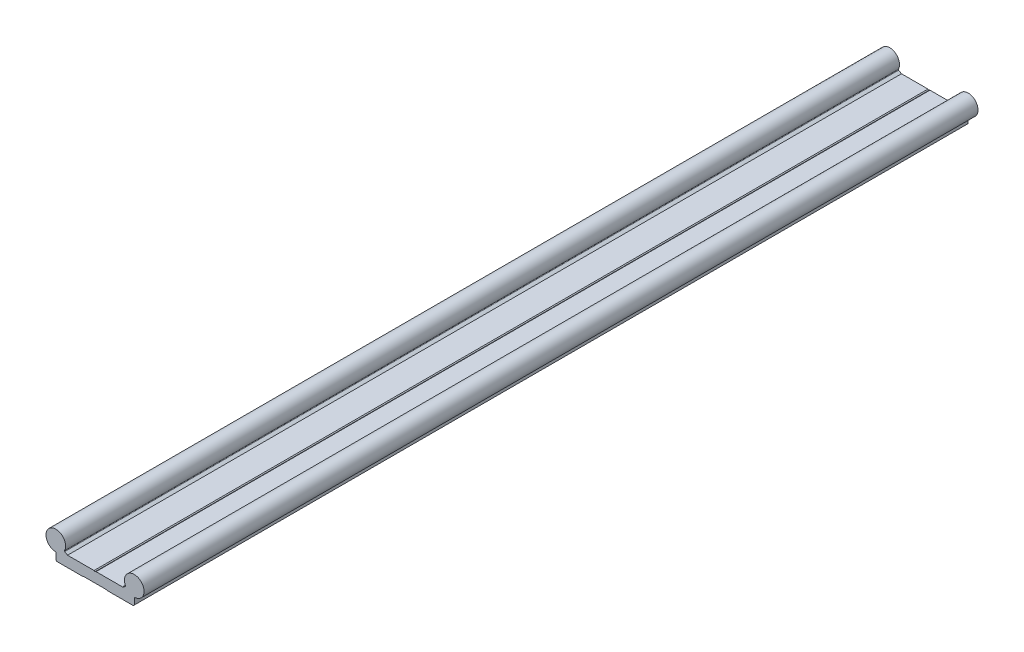
ISO-10303-21;
HEADER;
FILE_DESCRIPTION(('STEP AP214'),'2;1');
FILE_NAME('part.step','',(''),(''),'','','');
FILE_SCHEMA(('AUTOMOTIVE_DESIGN { 1 0 10303 214 1 1 1 1 }'));
ENDSEC;
DATA;
#1=APPLICATION_CONTEXT('core data for automotive mechanical design processes');
#2=APPLICATION_PROTOCOL_DEFINITION('international standard','automotive_design',2000,#1);
#3=PRODUCT_CONTEXT('',#1,'mechanical');
#4=PRODUCT('Part','Part','',(#3));
#5=PRODUCT_RELATED_PRODUCT_CATEGORY('part','',(#4));
#6=PRODUCT_DEFINITION_FORMATION('','',#4);
#7=PRODUCT_DEFINITION_CONTEXT('part definition',#1,'design');
#8=PRODUCT_DEFINITION('design','',#6,#7);
#9=PRODUCT_DEFINITION_SHAPE('','',#8);
#10=(LENGTH_UNIT() NAMED_UNIT(*) SI_UNIT(.MILLI.,.METRE.));
#11=(NAMED_UNIT(*) PLANE_ANGLE_UNIT() SI_UNIT($,.RADIAN.));
#12=(NAMED_UNIT(*) SI_UNIT($,.STERADIAN.) SOLID_ANGLE_UNIT());
#13=UNCERTAINTY_MEASURE_WITH_UNIT(LENGTH_MEASURE(1.E-05),#10,'distance_accuracy_value','');
#14=(GEOMETRIC_REPRESENTATION_CONTEXT(3) GLOBAL_UNCERTAINTY_ASSIGNED_CONTEXT((#13)) GLOBAL_UNIT_ASSIGNED_CONTEXT((#10,
#11,#12)) REPRESENTATION_CONTEXT('',''));
#15=CARTESIAN_POINT('',(0.,0.,0.));
#16=DIRECTION('',(0.,0.,1.));
#17=DIRECTION('',(1.,0.,0.));
#18=AXIS2_PLACEMENT_3D('',#15,#16,#17);
#19=CARTESIAN_POINT('',(-20.,3.708497,0.));
#20=DIRECTION('',(-1.,0.,0.));
#21=DIRECTION('',(0.,0.,1.));
#22=AXIS2_PLACEMENT_3D('',#19,#20,#21);
#23=PLANE('',#22);
#24=DIRECTION('',(0.,-1.,0.));
#25=VECTOR('',#24,1.);
#26=CARTESIAN_POINT('',(-20.,3.708497,425.));
#27=LINE('',#26,#25);
#28=CARTESIAN_POINT('',(-20.,3.708497,425.));
#29=VERTEX_POINT('',#28);
#30=CARTESIAN_POINT('',(-20.,0.500000000000001,425.));
#31=VERTEX_POINT('',#30);
#32=EDGE_CURVE('E207',#29,#31,#27,.T.);
#33=ORIENTED_EDGE('',*,*,#32,.F.);
#34=DIRECTION('',(0.,0.,1.));
#35=VECTOR('',#34,1.);
#36=CARTESIAN_POINT('',(-20.,3.708497,0.));
#37=LINE('',#36,#35);
#38=CARTESIAN_POINT('',(-20.,3.708497,0.));
#39=VERTEX_POINT('',#38);
#40=EDGE_CURVE('E11',#39,#29,#37,.T.);
#41=ORIENTED_EDGE('',*,*,#40,.F.);
#42=DIRECTION('',(0.,-1.,0.));
#43=VECTOR('',#42,1.);
#44=CARTESIAN_POINT('',(-20.,3.708497,0.));
#45=LINE('',#44,#43);
#46=CARTESIAN_POINT('',(-20.,0.500000000000001,0.));
#47=VERTEX_POINT('',#46);
#48=EDGE_CURVE('E266',#39,#47,#45,.T.);
#49=ORIENTED_EDGE('',*,*,#48,.T.);
#50=DIRECTION('',(0.,0.,1.));
#51=VECTOR('',#50,1.);
#52=CARTESIAN_POINT('',(-20.,0.500000000000001,0.));
#53=LINE('',#52,#51);
#54=EDGE_CURVE('E35',#47,#31,#53,.T.);
#55=ORIENTED_EDGE('',*,*,#54,.T.);
#56=EDGE_LOOP('',(#33,#41,#49,#55));
#57=FACE_BOUND('',#56,.T.);
#58=ADVANCED_FACE('F32',(#57),#23,.T.);
#59=CARTESIAN_POINT('',(-20.3,3.708497,0.));
#60=DIRECTION('',(0.,0.,1.));
#61=DIRECTION('',(1.,0.,0.));
#62=AXIS2_PLACEMENT_3D('',#59,#60,#61);
#63=CYLINDRICAL_SURFACE('',#62,0.299999999999948);
#64=CARTESIAN_POINT('',(-20.3,3.708497,425.));
#65=DIRECTION('',(0.,0.,-1.));
#66=DIRECTION('',(-1.,0.,0.));
#67=AXIS2_PLACEMENT_3D('',#64,#65,#66);
#68=CIRCLE('',#67,0.299999999999948);
#69=CARTESIAN_POINT('',(-20.2830188679496,4.00801601634825,425.));
#70=VERTEX_POINT('',#69);
#71=EDGE_CURVE('E264',#70,#29,#68,.T.);
#72=ORIENTED_EDGE('',*,*,#71,.F.);
#73=DIRECTION('',(0.,0.,1.));
#74=VECTOR('',#73,1.);
#75=CARTESIAN_POINT('',(-20.2830188679496,4.00801601634825,0.));
#76=LINE('',#75,#74);
#77=CARTESIAN_POINT('',(-20.2830188679496,4.00801601634825,0.));
#78=VERTEX_POINT('',#77);
#79=EDGE_CURVE('E41',#78,#70,#76,.T.);
#80=ORIENTED_EDGE('',*,*,#79,.F.);
#81=CARTESIAN_POINT('',(-20.3,3.708497,0.));
#82=DIRECTION('',(0.,0.,-1.));
#83=DIRECTION('',(-1.,0.,0.));
#84=AXIS2_PLACEMENT_3D('',#81,#82,#83);
#85=CIRCLE('',#84,0.299999999999948);
#86=EDGE_CURVE('E197',#78,#39,#85,.T.);
#87=ORIENTED_EDGE('',*,*,#86,.T.);
#88=ORIENTED_EDGE('',*,*,#40,.T.);
#89=EDGE_LOOP('',(#72,#80,#87,#88));
#90=FACE_BOUND('',#89,.T.);
#91=ADVANCED_FACE('F304',(#90),#63,.F.);
#92=CARTESIAN_POINT('',(-19.9999999910255,8.99999978829809,0.));
#93=DIRECTION('',(0.,0.,1.));
#94=DIRECTION('',(1.,0.,0.));
#95=AXIS2_PLACEMENT_3D('',#92,#93,#94);
#96=CYLINDRICAL_SURFACE('',#95,5.00000016641058);
#97=CARTESIAN_POINT('',(-19.9999999910255,8.99999978829809,425.));
#98=DIRECTION('',(0.,0.,1.));
#99=DIRECTION('',(1.,0.,0.));
#100=AXIS2_PLACEMENT_3D('',#97,#98,#99);
#101=CIRCLE('',#100,5.00000016641058);
#102=CARTESIAN_POINT('',(-15.5486051742578,6.72292143010332,425.));
#103=VERTEX_POINT('',#102);
#104=EDGE_CURVE('E184',#103,#70,#101,.T.);
#105=ORIENTED_EDGE('',*,*,#104,.F.);
#106=DIRECTION('',(0.,0.,1.));
#107=VECTOR('',#106,1.);
#108=CARTESIAN_POINT('',(-15.5486051742578,6.72292143010332,0.));
#109=LINE('',#108,#107);
#110=CARTESIAN_POINT('',(-15.5486051742578,6.72292143010332,0.));
#111=VERTEX_POINT('',#110);
#112=EDGE_CURVE('E179',#111,#103,#109,.T.);
#113=ORIENTED_EDGE('',*,*,#112,.F.);
#114=CARTESIAN_POINT('',(-19.9999999910255,8.99999978829809,0.));
#115=DIRECTION('',(0.,0.,1.));
#116=DIRECTION('',(1.,0.,0.));
#117=AXIS2_PLACEMENT_3D('',#114,#115,#116);
#118=CIRCLE('',#117,5.00000016641058);
#119=EDGE_CURVE('E182',#111,#78,#118,.T.);
#120=ORIENTED_EDGE('',*,*,#119,.T.);
#121=ORIENTED_EDGE('',*,*,#79,.T.);
#122=EDGE_LOOP('',(#105,#113,#120,#121));
#123=FACE_BOUND('',#122,.T.);
#124=ADVANCED_FACE('F181',(#123),#96,.T.);
#125=CARTESIAN_POINT('',(-15.2815211177297,6.58629654060844,0.));
#126=DIRECTION('',(0.,0.,1.));
#127=DIRECTION('',(1.,0.,0.));
#128=AXIS2_PLACEMENT_3D('',#125,#126,#127);
#129=CYLINDRICAL_SURFACE('',#128,0.300000422801319);
#130=CARTESIAN_POINT('',(-15.2815211177297,6.58629654060844,425.));
#131=DIRECTION('',(0.,0.,-1.));
#132=DIRECTION('',(-1.,0.,0.));
#133=AXIS2_PLACEMENT_3D('',#130,#131,#132);
#134=CIRCLE('',#133,0.300000422801319);
#135=CARTESIAN_POINT('',(-15.431521324407,6.32648855058939,425.));
#136=VERTEX_POINT('',#135);
#137=EDGE_CURVE('E261',#136,#103,#134,.T.);
#138=ORIENTED_EDGE('',*,*,#137,.F.);
#139=DIRECTION('',(0.,0.,1.));
#140=VECTOR('',#139,1.);
#141=CARTESIAN_POINT('',(-15.431521324407,6.32648855058939,0.));
#142=LINE('',#141,#140);
#143=CARTESIAN_POINT('',(-15.431521324407,6.32648855058939,0.));
#144=VERTEX_POINT('',#143);
#145=EDGE_CURVE('E189',#144,#136,#142,.T.);
#146=ORIENTED_EDGE('',*,*,#145,.F.);
#147=CARTESIAN_POINT('',(-15.2815211177297,6.58629654060844,0.));
#148=DIRECTION('',(0.,0.,-1.));
#149=DIRECTION('',(-1.,0.,0.));
#150=AXIS2_PLACEMENT_3D('',#147,#148,#149);
#151=CIRCLE('',#150,0.300000422801319);
#152=EDGE_CURVE('E195',#144,#111,#151,.T.);
#153=ORIENTED_EDGE('',*,*,#152,.T.);
#154=ORIENTED_EDGE('',*,*,#112,.T.);
#155=EDGE_LOOP('',(#138,#146,#153,#154));
#156=FACE_BOUND('',#155,.T.);
#157=ADVANCED_FACE('F199',(#156),#129,.F.);
#158=CARTESIAN_POINT('',(-14.000000170596,5.49999946178658,0.));
#159=DIRECTION('',(0.499999984255417,0.866025412874578,0.));
#160=DIRECTION('',(-0.866025412874578,0.499999984255417,0.));
#161=AXIS2_PLACEMENT_3D('',#158,#159,#160);
#162=PLANE('',#161);
#163=DIRECTION('',(-0.866025412874578,0.499999984255417,0.));
#164=VECTOR('',#163,1.);
#165=CARTESIAN_POINT('',(-14.000000170596,5.49999946178658,425.));
#166=LINE('',#165,#164);
#167=CARTESIAN_POINT('',(-14.000000170596,5.49999946178658,425.));
#168=VERTEX_POINT('',#167);
#169=EDGE_CURVE('E258',#168,#136,#166,.T.);
#170=ORIENTED_EDGE('',*,*,#169,.F.);
#171=DIRECTION('',(0.,0.,1.));
#172=VECTOR('',#171,1.);
#173=CARTESIAN_POINT('',(-14.000000170596,5.49999946178658,0.));
#174=LINE('',#173,#172);
#175=CARTESIAN_POINT('',(-14.000000170596,5.49999946178658,0.));
#176=VERTEX_POINT('',#175);
#177=EDGE_CURVE('E270',#176,#168,#174,.T.);
#178=ORIENTED_EDGE('',*,*,#177,.F.);
#179=DIRECTION('',(-0.866025412874578,0.499999984255417,0.));
#180=VECTOR('',#179,1.);
#181=CARTESIAN_POINT('',(-14.000000170596,5.49999946178658,0.));
#182=LINE('',#181,#180);
#183=EDGE_CURVE('E200',#176,#144,#182,.T.);
#184=ORIENTED_EDGE('',*,*,#183,.T.);
#185=ORIENTED_EDGE('',*,*,#145,.T.);
#186=EDGE_LOOP('',(#170,#178,#184,#185));
#187=FACE_BOUND('',#186,.T.);
#188=ADVANCED_FACE('F317',(#187),#162,.T.);
#189=CARTESIAN_POINT('',(-0.500000170595967,5.49999946178658,0.));
#190=DIRECTION('',(0.,1.,0.));
#191=DIRECTION('',(0.,0.,1.));
#192=AXIS2_PLACEMENT_3D('',#189,#190,#191);
#193=PLANE('',#192);
#194=DIRECTION('',(-1.,0.,0.));
#195=VECTOR('',#194,1.);
#196=CARTESIAN_POINT('',(-0.500000170595967,5.49999946178658,425.));
#197=LINE('',#196,#195);
#198=CARTESIAN_POINT('',(-0.500000170595967,5.49999946178658,425.));
#199=VERTEX_POINT('',#198);
#200=EDGE_CURVE('E255',#199,#168,#197,.T.);
#201=ORIENTED_EDGE('',*,*,#200,.F.);
#202=DIRECTION('',(0.,0.,1.));
#203=VECTOR('',#202,1.);
#204=CARTESIAN_POINT('',(-0.500000170595967,5.49999946178658,0.));
#205=LINE('',#204,#203);
#206=CARTESIAN_POINT('',(-0.500000170595967,5.49999946178658,0.));
#207=VERTEX_POINT('',#206);
#208=EDGE_CURVE('E272',#207,#199,#205,.T.);
#209=ORIENTED_EDGE('',*,*,#208,.F.);
#210=DIRECTION('',(-1.,0.,0.));
#211=VECTOR('',#210,1.);
#212=CARTESIAN_POINT('',(-0.500000170595967,5.49999946178658,0.));
#213=LINE('',#212,#211);
#214=EDGE_CURVE('E202',#207,#176,#213,.T.);
#215=ORIENTED_EDGE('',*,*,#214,.T.);
#216=ORIENTED_EDGE('',*,*,#177,.T.);
#217=EDGE_LOOP('',(#201,#209,#215,#216));
#218=FACE_BOUND('',#217,.T.);
#219=ADVANCED_FACE('F320',(#218),#193,.T.);
#220=CARTESIAN_POINT('',(-1.70595966294401E-07,5.21132446178658,0.));
#221=DIRECTION('',(0.499999825156179,0.866025504730543,0.));
#222=DIRECTION('',(-0.866025504730543,0.499999825156179,0.));
#223=AXIS2_PLACEMENT_3D('',#220,#221,#222);
#224=PLANE('',#223);
#225=DIRECTION('',(-0.866025504730542,0.499999825156179,0.));
#226=VECTOR('',#225,1.);
#227=CARTESIAN_POINT('',(-1.70595966294401E-07,5.21132446178658,425.));
#228=LINE('',#227,#226);
#229=CARTESIAN_POINT('',(-1.70595966294401E-07,5.21132446178658,425.));
#230=VERTEX_POINT('',#229);
#231=EDGE_CURVE('E252',#230,#199,#228,.T.);
#232=ORIENTED_EDGE('',*,*,#231,.F.);
#233=DIRECTION('',(0.,0.,1.));
#234=VECTOR('',#233,1.);
#235=CARTESIAN_POINT('',(-1.70595966294401E-07,5.21132446178658,0.));
#236=LINE('',#235,#234);
#237=CARTESIAN_POINT('',(-1.70595966294401E-07,5.21132446178658,0.));
#238=VERTEX_POINT('',#237);
#239=EDGE_CURVE('E274',#238,#230,#236,.T.);
#240=ORIENTED_EDGE('',*,*,#239,.F.);
#241=DIRECTION('',(-0.866025504730542,0.499999825156179,0.));
#242=VECTOR('',#241,1.);
#243=CARTESIAN_POINT('',(-1.70595966294401E-07,5.21132446178658,0.));
#244=LINE('',#243,#242);
#245=EDGE_CURVE('E569',#238,#207,#244,.T.);
#246=ORIENTED_EDGE('',*,*,#245,.T.);
#247=ORIENTED_EDGE('',*,*,#208,.T.);
#248=EDGE_LOOP('',(#232,#240,#246,#247));
#249=FACE_BOUND('',#248,.T.);
#250=ADVANCED_FACE('F324',(#249),#224,.T.);
#251=CARTESIAN_POINT('',(0.499999829404034,5.49999946178658,0.));
#252=DIRECTION('',(-0.499999825156179,0.866025504730542,0.));
#253=DIRECTION('',(-0.866025504730543,-0.499999825156179,0.));
#254=AXIS2_PLACEMENT_3D('',#251,#252,#253);
#255=PLANE('',#254);
#256=DIRECTION('',(-0.866025504730542,-0.499999825156179,0.));
#257=VECTOR('',#256,1.);
#258=CARTESIAN_POINT('',(0.499999829404034,5.49999946178658,425.));
#259=LINE('',#258,#257);
#260=CARTESIAN_POINT('',(0.499999829404034,5.49999946178658,425.));
#261=VERTEX_POINT('',#260);
#262=EDGE_CURVE('E249',#261,#230,#259,.T.);
#263=ORIENTED_EDGE('',*,*,#262,.F.);
#264=DIRECTION('',(0.,0.,1.));
#265=VECTOR('',#264,1.);
#266=CARTESIAN_POINT('',(0.499999829404034,5.49999946178658,0.));
#267=LINE('',#266,#265);
#268=CARTESIAN_POINT('',(0.499999829404034,5.49999946178658,0.));
#269=VERTEX_POINT('',#268);
#270=EDGE_CURVE('E276',#269,#261,#267,.T.);
#271=ORIENTED_EDGE('',*,*,#270,.F.);
#272=DIRECTION('',(-0.866025504730542,-0.499999825156179,0.));
#273=VECTOR('',#272,1.);
#274=CARTESIAN_POINT('',(0.499999829404034,5.49999946178658,0.));
#275=LINE('',#274,#273);
#276=EDGE_CURVE('E573',#269,#238,#275,.T.);
#277=ORIENTED_EDGE('',*,*,#276,.T.);
#278=ORIENTED_EDGE('',*,*,#239,.T.);
#279=EDGE_LOOP('',(#263,#271,#277,#278));
#280=FACE_BOUND('',#279,.T.);
#281=ADVANCED_FACE('F328',(#280),#255,.T.);
#282=CARTESIAN_POINT('',(13.999999829404,5.49999946178658,0.));
#283=DIRECTION('',(0.,1.,0.));
#284=DIRECTION('',(0.,0.,1.));
#285=AXIS2_PLACEMENT_3D('',#282,#283,#284);
#286=PLANE('',#285);
#287=DIRECTION('',(-1.,0.,0.));
#288=VECTOR('',#287,1.);
#289=CARTESIAN_POINT('',(13.999999829404,5.49999946178658,425.));
#290=LINE('',#289,#288);
#291=CARTESIAN_POINT('',(13.999999829404,5.49999946178658,425.));
#292=VERTEX_POINT('',#291);
#293=EDGE_CURVE('E246',#292,#261,#290,.T.);
#294=ORIENTED_EDGE('',*,*,#293,.F.);
#295=DIRECTION('',(0.,0.,1.));
#296=VECTOR('',#295,1.);
#297=CARTESIAN_POINT('',(13.999999829404,5.49999946178658,0.));
#298=LINE('',#297,#296);
#299=CARTESIAN_POINT('',(13.999999829404,5.49999946178658,0.));
#300=VERTEX_POINT('',#299);
#301=EDGE_CURVE('E278',#300,#292,#298,.T.);
#302=ORIENTED_EDGE('',*,*,#301,.F.);
#303=DIRECTION('',(-1.,0.,0.));
#304=VECTOR('',#303,1.);
#305=CARTESIAN_POINT('',(13.999999829404,5.49999946178658,0.));
#306=LINE('',#305,#304);
#307=EDGE_CURVE('E562',#300,#269,#306,.T.);
#308=ORIENTED_EDGE('',*,*,#307,.T.);
#309=ORIENTED_EDGE('',*,*,#270,.T.);
#310=EDGE_LOOP('',(#294,#302,#308,#309));
#311=FACE_BOUND('',#310,.T.);
#312=ADVANCED_FACE('F332',(#311),#286,.T.);
#313=CARTESIAN_POINT('',(15.4315209832149,6.32648855058936,0.));
#314=DIRECTION('',(-0.499999984255416,0.866025412874578,0.));
#315=DIRECTION('',(-0.866025412874578,-0.499999984255416,0.));
#316=AXIS2_PLACEMENT_3D('',#313,#314,#315);
#317=PLANE('',#316);
#318=DIRECTION('',(-0.866025412874578,-0.499999984255416,0.));
#319=VECTOR('',#318,1.);
#320=CARTESIAN_POINT('',(15.4315209832149,6.32648855058936,425.));
#321=LINE('',#320,#319);
#322=CARTESIAN_POINT('',(15.4315209832149,6.32648855058936,425.));
#323=VERTEX_POINT('',#322);
#324=EDGE_CURVE('E243',#323,#292,#321,.T.);
#325=ORIENTED_EDGE('',*,*,#324,.F.);
#326=DIRECTION('',(0.,0.,1.));
#327=VECTOR('',#326,1.);
#328=CARTESIAN_POINT('',(15.4315209832149,6.32648855058936,0.));
#329=LINE('',#328,#327);
#330=CARTESIAN_POINT('',(15.4315209832149,6.32648855058936,0.));
#331=VERTEX_POINT('',#330);
#332=EDGE_CURVE('E280',#331,#323,#329,.T.);
#333=ORIENTED_EDGE('',*,*,#332,.F.);
#334=DIRECTION('',(-0.866025412874578,-0.499999984255416,0.));
#335=VECTOR('',#334,1.);
#336=CARTESIAN_POINT('',(15.4315209832149,6.32648855058936,0.));
#337=LINE('',#336,#335);
#338=EDGE_CURVE('E558',#331,#300,#337,.T.);
#339=ORIENTED_EDGE('',*,*,#338,.T.);
#340=ORIENTED_EDGE('',*,*,#301,.T.);
#341=EDGE_LOOP('',(#325,#333,#339,#340));
#342=FACE_BOUND('',#341,.T.);
#343=ADVANCED_FACE('F336',(#342),#317,.T.);
#344=CARTESIAN_POINT('',(15.2815208238851,6.58629645860024,0.));
#345=DIRECTION('',(0.,0.,1.));
#346=DIRECTION('',(1.,0.,0.));
#347=AXIS2_PLACEMENT_3D('',#344,#345,#346);
#348=CYLINDRICAL_SURFACE('',#347,0.300000328106433);
#349=CARTESIAN_POINT('',(15.2815208238851,6.58629645860024,425.));
#350=DIRECTION('',(0.,0.,-1.));
#351=DIRECTION('',(-1.,0.,0.));
#352=AXIS2_PLACEMENT_3D('',#349,#350,#351);
#353=CIRCLE('',#352,0.300000328106433);
#354=CARTESIAN_POINT('',(15.5486047963378,6.72292130452095,425.));
#355=VERTEX_POINT('',#354);
#356=EDGE_CURVE('E240',#355,#323,#353,.T.);
#357=ORIENTED_EDGE('',*,*,#356,.F.);
#358=DIRECTION('',(0.,0.,1.));
#359=VECTOR('',#358,1.);
#360=CARTESIAN_POINT('',(15.5486047963378,6.72292130452095,0.));
#361=LINE('',#360,#359);
#362=CARTESIAN_POINT('',(15.5486047963378,6.72292130452095,0.));
#363=VERTEX_POINT('',#362);
#364=EDGE_CURVE('E282',#363,#355,#361,.T.);
#365=ORIENTED_EDGE('',*,*,#364,.F.);
#366=CARTESIAN_POINT('',(15.2815208238851,6.58629645860024,0.));
#367=DIRECTION('',(0.,0.,-1.));
#368=DIRECTION('',(-1.,0.,0.));
#369=AXIS2_PLACEMENT_3D('',#366,#367,#368);
#370=CIRCLE('',#369,0.300000328106433);
#371=EDGE_CURVE('E579',#363,#331,#370,.T.);
#372=ORIENTED_EDGE('',*,*,#371,.T.);
#373=ORIENTED_EDGE('',*,*,#332,.T.);
#374=EDGE_LOOP('',(#357,#365,#372,#373));
#375=FACE_BOUND('',#374,.T.);
#376=ADVANCED_FACE('F340',(#375),#348,.F.);
#377=CARTESIAN_POINT('',(19.9999998258351,8.99999976210216,0.));
#378=DIRECTION('',(0.,0.,1.));
#379=DIRECTION('',(1.,0.,0.));
#380=AXIS2_PLACEMENT_3D('',#377,#378,#379);
#381=CYLINDRICAL_SURFACE('',#380,5.00000040106134);
#382=CARTESIAN_POINT('',(19.9999998258351,8.99999976210216,425.));
#383=DIRECTION('',(0.,0.,1.));
#384=DIRECTION('',(1.,0.,0.));
#385=AXIS2_PLACEMENT_3D('',#382,#383,#384);
#386=CIRCLE('',#385,5.00000040106134);
#387=CARTESIAN_POINT('',(20.283018838172,4.00801576280197,425.));
#388=VERTEX_POINT('',#387);
#389=EDGE_CURVE('E237',#388,#355,#386,.T.);
#390=ORIENTED_EDGE('',*,*,#389,.F.);
#391=DIRECTION('',(0.,0.,1.));
#392=VECTOR('',#391,1.);
#393=CARTESIAN_POINT('',(20.283018838172,4.00801576280197,0.));
#394=LINE('',#393,#392);
#395=CARTESIAN_POINT('',(20.283018838172,4.00801576280197,0.));
#396=VERTEX_POINT('',#395);
#397=EDGE_CURVE('E284',#396,#388,#394,.T.);
#398=ORIENTED_EDGE('',*,*,#397,.F.);
#399=CARTESIAN_POINT('',(19.9999998258351,8.99999976210216,0.));
#400=DIRECTION('',(0.,0.,1.));
#401=DIRECTION('',(1.,0.,0.));
#402=AXIS2_PLACEMENT_3D('',#399,#400,#401);
#403=CIRCLE('',#402,5.00000040106134);
#404=EDGE_CURVE('E551',#396,#363,#403,.T.);
#405=ORIENTED_EDGE('',*,*,#404,.T.);
#406=ORIENTED_EDGE('',*,*,#364,.T.);
#407=EDGE_LOOP('',(#390,#398,#405,#406));
#408=FACE_BOUND('',#407,.T.);
#409=ADVANCED_FACE('F344',(#408),#381,.T.);
#410=CARTESIAN_POINT('',(20.2999999762032,3.70849677062774,0.));
#411=DIRECTION('',(0.,0.,1.));
#412=DIRECTION('',(1.,0.,0.));
#413=AXIS2_PLACEMENT_3D('',#410,#411,#412);
#414=CYLINDRICAL_SURFACE('',#413,0.299999976203164);
#415=CARTESIAN_POINT('',(20.2999999762032,3.70849677062774,425.));
#416=DIRECTION('',(0.,0.,-1.));
#417=DIRECTION('',(-1.,0.,0.));
#418=AXIS2_PLACEMENT_3D('',#415,#416,#417);
#419=CIRCLE('',#418,0.299999976203164);
#420=CARTESIAN_POINT('',(20.,3.70849677062774,425.));
#421=VERTEX_POINT('',#420);
#422=EDGE_CURVE('E234',#421,#388,#419,.T.);
#423=ORIENTED_EDGE('',*,*,#422,.F.);
#424=DIRECTION('',(0.,0.,1.));
#425=VECTOR('',#424,1.);
#426=CARTESIAN_POINT('',(20.,3.70849677062774,0.));
#427=LINE('',#426,#425);
#428=CARTESIAN_POINT('',(20.,3.70849677062774,0.));
#429=VERTEX_POINT('',#428);
#430=EDGE_CURVE('E286',#429,#421,#427,.T.);
#431=ORIENTED_EDGE('',*,*,#430,.F.);
#432=CARTESIAN_POINT('',(20.2999999762032,3.70849677062774,0.));
#433=DIRECTION('',(0.,0.,-1.));
#434=DIRECTION('',(-1.,0.,0.));
#435=AXIS2_PLACEMENT_3D('',#432,#433,#434);
#436=CIRCLE('',#435,0.299999976203164);
#437=EDGE_CURVE('E547',#429,#396,#436,.T.);
#438=ORIENTED_EDGE('',*,*,#437,.T.);
#439=ORIENTED_EDGE('',*,*,#397,.T.);
#440=EDGE_LOOP('',(#423,#431,#438,#439));
#441=FACE_BOUND('',#440,.T.);
#442=ADVANCED_FACE('F348',(#441),#414,.F.);
#443=CARTESIAN_POINT('',(20.,0.5,0.));
#444=DIRECTION('',(1.,0.,0.));
#445=DIRECTION('',(0.,1.,0.));
#446=AXIS2_PLACEMENT_3D('',#443,#444,#445);
#447=PLANE('',#446);
#448=DIRECTION('',(0.,1.,0.));
#449=VECTOR('',#448,1.);
#450=CARTESIAN_POINT('',(20.,0.5,425.));
#451=LINE('',#450,#449);
#452=CARTESIAN_POINT('',(20.,0.5,425.));
#453=VERTEX_POINT('',#452);
#454=EDGE_CURVE('E231',#453,#421,#451,.T.);
#455=ORIENTED_EDGE('',*,*,#454,.F.);
#456=DIRECTION('',(0.,0.,1.));
#457=VECTOR('',#456,1.);
#458=CARTESIAN_POINT('',(20.,0.5,0.));
#459=LINE('',#458,#457);
#460=CARTESIAN_POINT('',(20.,0.5,0.));
#461=VERTEX_POINT('',#460);
#462=EDGE_CURVE('E288',#461,#453,#459,.T.);
#463=ORIENTED_EDGE('',*,*,#462,.F.);
#464=DIRECTION('',(0.,1.,0.));
#465=VECTOR('',#464,1.);
#466=CARTESIAN_POINT('',(20.,0.5,0.));
#467=LINE('',#466,#465);
#468=EDGE_CURVE('E583',#461,#429,#467,.T.);
#469=ORIENTED_EDGE('',*,*,#468,.T.);
#470=ORIENTED_EDGE('',*,*,#430,.T.);
#471=EDGE_LOOP('',(#455,#463,#469,#470));
#472=FACE_BOUND('',#471,.T.);
#473=ADVANCED_FACE('F352',(#472),#447,.T.);
#474=CARTESIAN_POINT('',(19.5,0.,0.));
#475=DIRECTION('',(0.707106781186547,-0.707106781186548,0.));
#476=DIRECTION('',(0.707106781186548,0.707106781186547,0.));
#477=AXIS2_PLACEMENT_3D('',#474,#475,#476);
#478=PLANE('',#477);
#479=DIRECTION('',(0.707106781186548,0.707106781186547,0.));
#480=VECTOR('',#479,1.);
#481=CARTESIAN_POINT('',(19.5,0.,425.));
#482=LINE('',#481,#480);
#483=CARTESIAN_POINT('',(19.5,0.,425.));
#484=VERTEX_POINT('',#483);
#485=EDGE_CURVE('E228',#484,#453,#482,.T.);
#486=ORIENTED_EDGE('',*,*,#485,.F.);
#487=DIRECTION('',(0.,0.,1.));
#488=VECTOR('',#487,1.);
#489=CARTESIAN_POINT('',(19.5,0.,0.));
#490=LINE('',#489,#488);
#491=CARTESIAN_POINT('',(19.5,0.,0.));
#492=VERTEX_POINT('',#491);
#493=EDGE_CURVE('E290',#492,#484,#490,.T.);
#494=ORIENTED_EDGE('',*,*,#493,.F.);
#495=DIRECTION('',(0.707106781186548,0.707106781186547,0.));
#496=VECTOR('',#495,1.);
#497=CARTESIAN_POINT('',(19.5,0.,0.));
#498=LINE('',#497,#496);
#499=EDGE_CURVE('E540',#492,#461,#498,.T.);
#500=ORIENTED_EDGE('',*,*,#499,.T.);
#501=ORIENTED_EDGE('',*,*,#462,.T.);
#502=EDGE_LOOP('',(#486,#494,#500,#501));
#503=FACE_BOUND('',#502,.T.);
#504=ADVANCED_FACE('F356',(#503),#478,.T.);
#505=CARTESIAN_POINT('',(6.,0.,0.));
#506=DIRECTION('',(0.,-1.,0.));
#507=DIRECTION('',(1.,0.,0.));
#508=AXIS2_PLACEMENT_3D('',#505,#506,#507);
#509=PLANE('',#508);
#510=DIRECTION('',(1.,0.,0.));
#511=VECTOR('',#510,1.);
#512=CARTESIAN_POINT('',(6.,0.,425.));
#513=LINE('',#512,#511);
#514=CARTESIAN_POINT('',(6.,0.,425.));
#515=VERTEX_POINT('',#514);
#516=EDGE_CURVE('E225',#515,#484,#513,.T.);
#517=ORIENTED_EDGE('',*,*,#516,.F.);
#518=DIRECTION('',(0.,0.,1.));
#519=VECTOR('',#518,1.);
#520=CARTESIAN_POINT('',(6.,0.,0.));
#521=LINE('',#520,#519);
#522=CARTESIAN_POINT('',(6.,0.,0.));
#523=VERTEX_POINT('',#522);
#524=EDGE_CURVE('E292',#523,#515,#521,.T.);
#525=ORIENTED_EDGE('',*,*,#524,.F.);
#526=DIRECTION('',(1.,0.,0.));
#527=VECTOR('',#526,1.);
#528=CARTESIAN_POINT('',(6.,0.,0.));
#529=LINE('',#528,#527);
#530=EDGE_CURVE('E536',#523,#492,#529,.T.);
#531=ORIENTED_EDGE('',*,*,#530,.T.);
#532=ORIENTED_EDGE('',*,*,#493,.T.);
#533=EDGE_LOOP('',(#517,#525,#531,#532));
#534=FACE_BOUND('',#533,.T.);
#535=ADVANCED_FACE('F360',(#534),#509,.T.);
#536=CARTESIAN_POINT('',(5.8,0.2,0.));
#537=DIRECTION('',(-0.707106781186547,-0.707106781186549,0.));
#538=DIRECTION('',(0.707106781186549,-0.707106781186546,0.));
#539=AXIS2_PLACEMENT_3D('',#536,#537,#538);
#540=PLANE('',#539);
#541=DIRECTION('',(0.707106781186549,-0.707106781186546,0.));
#542=VECTOR('',#541,1.);
#543=CARTESIAN_POINT('',(5.8,0.2,425.));
#544=LINE('',#543,#542);
#545=CARTESIAN_POINT('',(5.8,0.2,425.));
#546=VERTEX_POINT('',#545);
#547=EDGE_CURVE('E222',#546,#515,#544,.T.);
#548=ORIENTED_EDGE('',*,*,#547,.F.);
#549=DIRECTION('',(0.,0.,1.));
#550=VECTOR('',#549,1.);
#551=CARTESIAN_POINT('',(5.8,0.2,0.));
#552=LINE('',#551,#550);
#553=CARTESIAN_POINT('',(5.8,0.2,0.));
#554=VERTEX_POINT('',#553);
#555=EDGE_CURVE('E294',#554,#546,#552,.T.);
#556=ORIENTED_EDGE('',*,*,#555,.F.);
#557=DIRECTION('',(0.707106781186549,-0.707106781186546,0.));
#558=VECTOR('',#557,1.);
#559=CARTESIAN_POINT('',(5.8,0.2,0.));
#560=LINE('',#559,#558);
#561=EDGE_CURVE('E587',#554,#523,#560,.T.);
#562=ORIENTED_EDGE('',*,*,#561,.T.);
#563=ORIENTED_EDGE('',*,*,#524,.T.);
#564=EDGE_LOOP('',(#548,#556,#562,#563));
#565=FACE_BOUND('',#564,.T.);
#566=ADVANCED_FACE('F364',(#565),#540,.T.);
#567=CARTESIAN_POINT('',(-5.8,0.2,0.));
#568=DIRECTION('',(0.,-1.,0.));
#569=DIRECTION('',(1.,0.,0.));
#570=AXIS2_PLACEMENT_3D('',#567,#568,#569);
#571=PLANE('',#570);
#572=DIRECTION('',(1.,0.,0.));
#573=VECTOR('',#572,1.);
#574=CARTESIAN_POINT('',(-5.8,0.2,425.));
#575=LINE('',#574,#573);
#576=CARTESIAN_POINT('',(-5.8,0.2,425.));
#577=VERTEX_POINT('',#576);
#578=EDGE_CURVE('E219',#577,#546,#575,.T.);
#579=ORIENTED_EDGE('',*,*,#578,.F.);
#580=DIRECTION('',(0.,0.,1.));
#581=VECTOR('',#580,1.);
#582=CARTESIAN_POINT('',(-5.8,0.2,0.));
#583=LINE('',#582,#581);
#584=CARTESIAN_POINT('',(-5.8,0.2,0.));
#585=VERTEX_POINT('',#584);
#586=EDGE_CURVE('E296',#585,#577,#583,.T.);
#587=ORIENTED_EDGE('',*,*,#586,.F.);
#588=DIRECTION('',(1.,0.,0.));
#589=VECTOR('',#588,1.);
#590=CARTESIAN_POINT('',(-5.8,0.2,0.));
#591=LINE('',#590,#589);
#592=EDGE_CURVE('E529',#585,#554,#591,.T.);
#593=ORIENTED_EDGE('',*,*,#592,.T.);
#594=ORIENTED_EDGE('',*,*,#555,.T.);
#595=EDGE_LOOP('',(#579,#587,#593,#594));
#596=FACE_BOUND('',#595,.T.);
#597=ADVANCED_FACE('F368',(#596),#571,.T.);
#598=CARTESIAN_POINT('',(-6.,0.,0.));
#599=DIRECTION('',(0.707106781186547,-0.707106781186548,0.));
#600=DIRECTION('',(0.707106781186548,0.707106781186547,0.));
#601=AXIS2_PLACEMENT_3D('',#598,#599,#600);
#602=PLANE('',#601);
#603=DIRECTION('',(0.707106781186549,0.707106781186547,0.));
#604=VECTOR('',#603,1.);
#605=CARTESIAN_POINT('',(-6.,0.,425.));
#606=LINE('',#605,#604);
#607=CARTESIAN_POINT('',(-6.,0.,425.));
#608=VERTEX_POINT('',#607);
#609=EDGE_CURVE('E216',#608,#577,#606,.T.);
#610=ORIENTED_EDGE('',*,*,#609,.F.);
#611=DIRECTION('',(0.,0.,1.));
#612=VECTOR('',#611,1.);
#613=CARTESIAN_POINT('',(-6.,0.,0.));
#614=LINE('',#613,#612);
#615=CARTESIAN_POINT('',(-6.,0.,0.));
#616=VERTEX_POINT('',#615);
#617=EDGE_CURVE('E298',#616,#608,#614,.T.);
#618=ORIENTED_EDGE('',*,*,#617,.F.);
#619=DIRECTION('',(0.707106781186549,0.707106781186547,0.));
#620=VECTOR('',#619,1.);
#621=CARTESIAN_POINT('',(-6.,0.,0.));
#622=LINE('',#621,#620);
#623=EDGE_CURVE('E525',#616,#585,#622,.T.);
#624=ORIENTED_EDGE('',*,*,#623,.T.);
#625=ORIENTED_EDGE('',*,*,#586,.T.);
#626=EDGE_LOOP('',(#610,#618,#624,#625));
#627=FACE_BOUND('',#626,.T.);
#628=ADVANCED_FACE('F372',(#627),#602,.T.);
#629=CARTESIAN_POINT('',(-19.5,0.,0.));
#630=DIRECTION('',(0.,-1.,0.));
#631=DIRECTION('',(1.,0.,0.));
#632=AXIS2_PLACEMENT_3D('',#629,#630,#631);
#633=PLANE('',#632);
#634=DIRECTION('',(1.,0.,0.));
#635=VECTOR('',#634,1.);
#636=CARTESIAN_POINT('',(-19.5,0.,425.));
#637=LINE('',#636,#635);
#638=CARTESIAN_POINT('',(-19.5,0.,425.));
#639=VERTEX_POINT('',#638);
#640=EDGE_CURVE('E213',#639,#608,#637,.T.);
#641=ORIENTED_EDGE('',*,*,#640,.F.);
#642=DIRECTION('',(0.,0.,1.));
#643=VECTOR('',#642,1.);
#644=CARTESIAN_POINT('',(-19.5,0.,0.));
#645=LINE('',#644,#643);
#646=CARTESIAN_POINT('',(-19.5,0.,0.));
#647=VERTEX_POINT('',#646);
#648=EDGE_CURVE('E299',#647,#639,#645,.T.);
#649=ORIENTED_EDGE('',*,*,#648,.F.);
#650=DIRECTION('',(1.,0.,0.));
#651=VECTOR('',#650,1.);
#652=CARTESIAN_POINT('',(-19.5,0.,0.));
#653=LINE('',#652,#651);
#654=EDGE_CURVE('E591',#647,#616,#653,.T.);
#655=ORIENTED_EDGE('',*,*,#654,.T.);
#656=ORIENTED_EDGE('',*,*,#617,.T.);
#657=EDGE_LOOP('',(#641,#649,#655,#656));
#658=FACE_BOUND('',#657,.T.);
#659=ADVANCED_FACE('F376',(#658),#633,.T.);
#660=CARTESIAN_POINT('',(-20.,0.500000000000001,0.));
#661=DIRECTION('',(-0.707106781186547,-0.707106781186548,0.));
#662=DIRECTION('',(0.707106781186548,-0.707106781186547,0.));
#663=AXIS2_PLACEMENT_3D('',#660,#661,#662);
#664=PLANE('',#663);
#665=DIRECTION('',(0.707106781186548,-0.707106781186547,0.));
#666=VECTOR('',#665,1.);
#667=CARTESIAN_POINT('',(-20.,0.500000000000001,425.));
#668=LINE('',#667,#666);
#669=EDGE_CURVE('E210',#31,#639,#668,.T.);
#670=ORIENTED_EDGE('',*,*,#669,.F.);
#671=ORIENTED_EDGE('',*,*,#54,.F.);
#672=DIRECTION('',(0.707106781186548,-0.707106781186547,0.));
#673=VECTOR('',#672,1.);
#674=CARTESIAN_POINT('',(-20.,0.500000000000001,0.));
#675=LINE('',#674,#673);
#676=EDGE_CURVE('E593',#47,#647,#675,.T.);
#677=ORIENTED_EDGE('',*,*,#676,.T.);
#678=ORIENTED_EDGE('',*,*,#648,.T.);
#679=EDGE_LOOP('',(#670,#671,#677,#678));
#680=FACE_BOUND('',#679,.T.);
#681=ADVANCED_FACE('F301',(#680),#664,.T.);
#682=CARTESIAN_POINT('',(20.2999999762032,3.70849677062774,0.));
#683=DIRECTION('',(0.,0.,-1.));
#684=DIRECTION('',(-1.,0.,0.));
#685=AXIS2_PLACEMENT_3D('',#682,#683,#684);
#686=PLANE('',#685);
#687=ORIENTED_EDGE('',*,*,#48,.F.);
#688=ORIENTED_EDGE('',*,*,#86,.F.);
#689=ORIENTED_EDGE('',*,*,#119,.F.);
#690=ORIENTED_EDGE('',*,*,#152,.F.);
#691=ORIENTED_EDGE('',*,*,#183,.F.);
#692=ORIENTED_EDGE('',*,*,#214,.F.);
#693=ORIENTED_EDGE('',*,*,#245,.F.);
#694=ORIENTED_EDGE('',*,*,#276,.F.);
#695=ORIENTED_EDGE('',*,*,#307,.F.);
#696=ORIENTED_EDGE('',*,*,#338,.F.);
#697=ORIENTED_EDGE('',*,*,#371,.F.);
#698=ORIENTED_EDGE('',*,*,#404,.F.);
#699=ORIENTED_EDGE('',*,*,#437,.F.);
#700=ORIENTED_EDGE('',*,*,#468,.F.);
#701=ORIENTED_EDGE('',*,*,#499,.F.);
#702=ORIENTED_EDGE('',*,*,#530,.F.);
#703=ORIENTED_EDGE('',*,*,#561,.F.);
#704=ORIENTED_EDGE('',*,*,#592,.F.);
#705=ORIENTED_EDGE('',*,*,#623,.F.);
#706=ORIENTED_EDGE('',*,*,#654,.F.);
#707=ORIENTED_EDGE('',*,*,#676,.F.);
#708=EDGE_LOOP('',(#687,#688,#689,#690,#691,#692,#693,#694,#695,#696,#697,#698,#699,#700,#701,
#702,#703,#704,#705,#706,#707));
#709=FACE_BOUND('',#708,.T.);
#710=ADVANCED_FACE('F193',(#709),#686,.T.);
#711=CARTESIAN_POINT('',(20.2999999762032,3.70849677062774,425.));
#712=DIRECTION('',(0.,0.,-1.));
#713=DIRECTION('',(-1.,0.,0.));
#714=AXIS2_PLACEMENT_3D('',#711,#712,#713);
#715=PLANE('',#714);
#716=ORIENTED_EDGE('',*,*,#32,.T.);
#717=ORIENTED_EDGE('',*,*,#669,.T.);
#718=ORIENTED_EDGE('',*,*,#640,.T.);
#719=ORIENTED_EDGE('',*,*,#609,.T.);
#720=ORIENTED_EDGE('',*,*,#578,.T.);
#721=ORIENTED_EDGE('',*,*,#547,.T.);
#722=ORIENTED_EDGE('',*,*,#516,.T.);
#723=ORIENTED_EDGE('',*,*,#485,.T.);
#724=ORIENTED_EDGE('',*,*,#454,.T.);
#725=ORIENTED_EDGE('',*,*,#422,.T.);
#726=ORIENTED_EDGE('',*,*,#389,.T.);
#727=ORIENTED_EDGE('',*,*,#356,.T.);
#728=ORIENTED_EDGE('',*,*,#324,.T.);
#729=ORIENTED_EDGE('',*,*,#293,.T.);
#730=ORIENTED_EDGE('',*,*,#262,.T.);
#731=ORIENTED_EDGE('',*,*,#231,.T.);
#732=ORIENTED_EDGE('',*,*,#200,.T.);
#733=ORIENTED_EDGE('',*,*,#169,.T.);
#734=ORIENTED_EDGE('',*,*,#137,.T.);
#735=ORIENTED_EDGE('',*,*,#104,.T.);
#736=ORIENTED_EDGE('',*,*,#71,.T.);
#737=EDGE_LOOP('',(#716,#717,#718,#719,#720,#721,#722,#723,#724,#725,#726,#727,#728,#729,#730,
#731,#732,#733,#734,#735,#736));
#738=FACE_BOUND('',#737,.T.);
#739=ADVANCED_FACE('F303',(#738),#715,.F.);
#740=CLOSED_SHELL('',(#58,#91,#124,#157,#188,#219,#250,#281,#312,#343,#376,#409,#442,#473,#504,
#535,#566,#597,#628,#659,#681,#710,#739));
#741=MANIFOLD_SOLID_BREP('B2',#740);
#742=ADVANCED_BREP_SHAPE_REPRESENTATION('',(#18,#741),#14);
#743=SHAPE_DEFINITION_REPRESENTATION(#9,#742);
ENDSEC;
END-ISO-10303-21;
